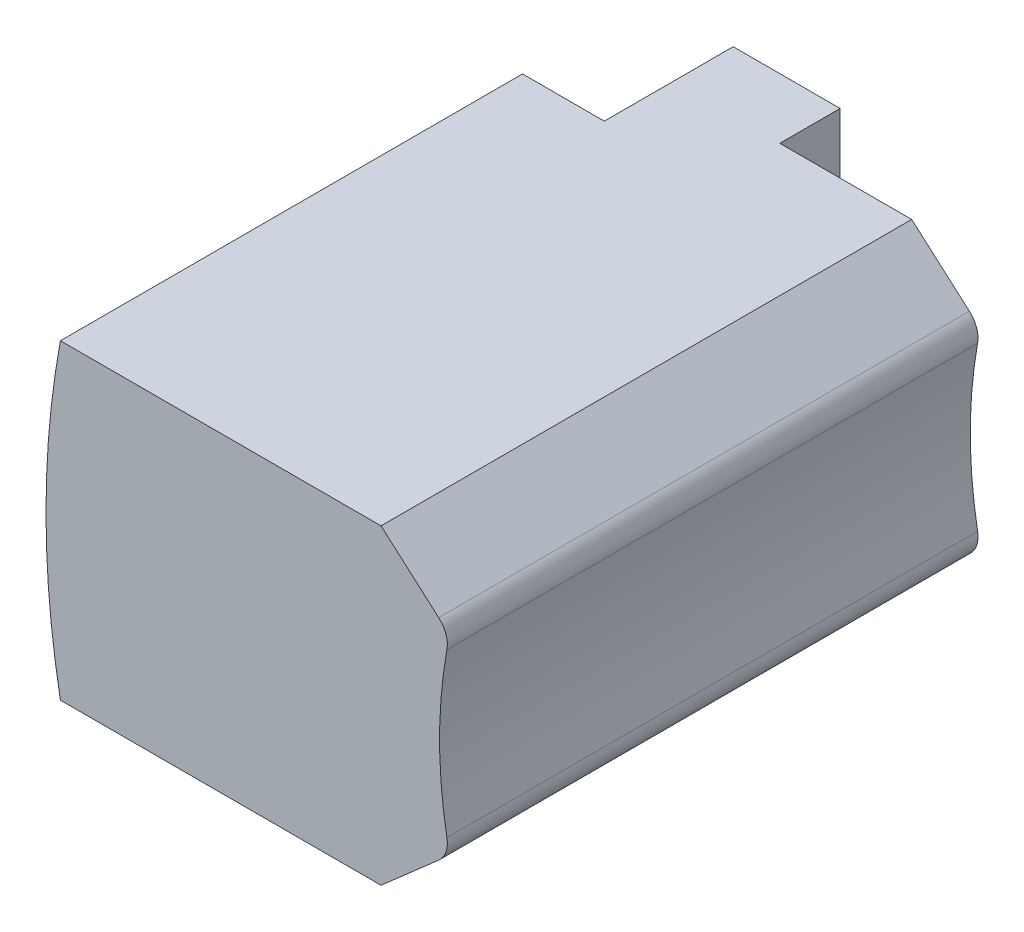
ISO-10303-21;
HEADER;
FILE_DESCRIPTION(('STEP AP214'),'2;1');
FILE_NAME('part.step','',(''),(''),'','','');
FILE_SCHEMA(('AUTOMOTIVE_DESIGN { 1 0 10303 214 1 1 1 1 }'));
ENDSEC;
DATA;
#1=APPLICATION_CONTEXT('core data for automotive mechanical design processes');
#2=APPLICATION_PROTOCOL_DEFINITION('international standard','automotive_design',2000,#1);
#3=PRODUCT_CONTEXT('',#1,'mechanical');
#4=PRODUCT('Part','Part','',(#3));
#5=PRODUCT_RELATED_PRODUCT_CATEGORY('part','',(#4));
#6=PRODUCT_DEFINITION_FORMATION('','',#4);
#7=PRODUCT_DEFINITION_CONTEXT('part definition',#1,'design');
#8=PRODUCT_DEFINITION('design','',#6,#7);
#9=PRODUCT_DEFINITION_SHAPE('','',#8);
#10=(LENGTH_UNIT() NAMED_UNIT(*) SI_UNIT(.MILLI.,.METRE.));
#11=(NAMED_UNIT(*) PLANE_ANGLE_UNIT() SI_UNIT($,.RADIAN.));
#12=(NAMED_UNIT(*) SI_UNIT($,.STERADIAN.) SOLID_ANGLE_UNIT());
#13=UNCERTAINTY_MEASURE_WITH_UNIT(LENGTH_MEASURE(1.E-05),#10,'distance_accuracy_value','');
#14=(GEOMETRIC_REPRESENTATION_CONTEXT(3) GLOBAL_UNCERTAINTY_ASSIGNED_CONTEXT((#13)) GLOBAL_UNIT_ASSIGNED_CONTEXT((#10,
#11,#12)) REPRESENTATION_CONTEXT('',''));
#15=CARTESIAN_POINT('',(0.,0.,0.));
#16=DIRECTION('',(0.,0.,1.));
#17=DIRECTION('',(1.,0.,0.));
#18=AXIS2_PLACEMENT_3D('',#15,#16,#17);
#19=CARTESIAN_POINT('',(30.001601500084,1.38260051198754E-10,77.7));
#20=DIRECTION('',(0.,0.,-1.));
#21=DIRECTION('',(1.,-2.934E-12,0.));
#22=AXIS2_PLACEMENT_3D('',#19,#20,#21);
#23=PLANE('',#22);
#24=CARTESIAN_POINT('',(42.6909678523777,-6.26876623080783,77.7));
#25=DIRECTION('',(0.,0.,-1.));
#26=DIRECTION('',(0.94433415351405,-0.32898785160991,0.));
#27=AXIS2_PLACEMENT_3D('',#24,#25,#26);
#28=CIRCLE('',#27,1.85);
#29=CARTESIAN_POINT('',(44.5110524087522,-5.93741715860799,77.7));
#30=VERTEX_POINT('',#29);
#31=CARTESIAN_POINT('',(43.9111825704376,-7.65929707973922,77.7));
#32=VERTEX_POINT('',#31);
#33=EDGE_CURVE('E347',#30,#32,#28,.T.);
#34=ORIENTED_EDGE('',*,*,#33,.F.);
#35=CARTESIAN_POINT('',(77.125,0.,77.7));
#36=DIRECTION('',(0.,0.,-1.));
#37=DIRECTION('',(0.977175666662194,0.212432851704476,0.));
#38=AXIS2_PLACEMENT_3D('',#35,#36,#37);
#39=CIRCLE('',#38,33.15);
#40=CARTESIAN_POINT('',(44.511052408787,5.93741715879937,77.7));
#41=VERTEX_POINT('',#40);
#42=EDGE_CURVE('E333',#30,#41,#39,.T.);
#43=ORIENTED_EDGE('',*,*,#42,.T.);
#44=CARTESIAN_POINT('',(42.6909678524145,6.26876623100989,77.7));
#45=DIRECTION('',(0.,0.,-1.));
#46=DIRECTION('',(0.944334153515979,0.32898785160437,0.));
#47=AXIS2_PLACEMENT_3D('',#44,#45,#46);
#48=CIRCLE('',#47,1.85);
#49=CARTESIAN_POINT('',(43.9111825704826,7.65929707993412,77.7));
#50=VERTEX_POINT('',#49);
#51=EDGE_CURVE('E238',#50,#41,#48,.T.);
#52=ORIENTED_EDGE('',*,*,#51,.F.);
#53=DIRECTION('',(-0.751638296715807,0.659575523280057,0.));
#54=VECTOR('',#53,1.);
#55=CARTESIAN_POINT('',(42.3146403354953,9.06029032985442,77.7));
#56=LINE('',#55,#54);
#57=CARTESIAN_POINT('',(39.7053356906447,11.3500000001098,77.7));
#58=VERTEX_POINT('',#57);
#59=EDGE_CURVE('E249',#50,#58,#56,.T.);
#60=ORIENTED_EDGE('',*,*,#59,.T.);
#61=DIRECTION('',(-1.,2.93409424263259E-12,0.));
#62=VECTOR('',#61,1.);
#63=CARTESIAN_POINT('',(26.1446641110108,11.3500000001496,77.7));
#64=LINE('',#63,#62);
#65=CARTESIAN_POINT('',(16.3253289482884,11.3500000001781,77.7));
#66=VERTEX_POINT('',#65);
#67=EDGE_CURVE('E212',#58,#66,#64,.T.);
#68=ORIENTED_EDGE('',*,*,#67,.T.);
#69=CARTESIAN_POINT('',(77.125,0.,77.7));
#70=DIRECTION('',(0.,0.,1.));
#71=DIRECTION('',(-0.896391606528745,-0.443263000649521,0.));
#72=AXIS2_PLACEMENT_3D('',#69,#70,#71);
#73=CIRCLE('',#72,61.85);
#74=CARTESIAN_POINT('',(16.3253289482218,-11.3499999998214,77.7));
#75=VERTEX_POINT('',#74);
#76=EDGE_CURVE('E228',#66,#75,#73,.T.);
#77=ORIENTED_EDGE('',*,*,#76,.T.);
#78=DIRECTION('',(1.,-2.93390575736741E-12,0.));
#79=VECTOR('',#78,1.);
#80=CARTESIAN_POINT('',(30.0446641109441,-11.3499999998619,77.7));
#81=LINE('',#80,#79);
#82=CARTESIAN_POINT('',(39.7053356905781,-11.3499999998902,77.7));
#83=VERTEX_POINT('',#82);
#84=EDGE_CURVE('E59',#75,#83,#81,.T.);
#85=ORIENTED_EDGE('',*,*,#84,.T.);
#86=DIRECTION('',(0.751638296719677,0.659575523275647,0.));
#87=VECTOR('',#86,1.);
#88=CARTESIAN_POINT('',(30.6498990329774,-19.2963012966614,77.7));
#89=LINE('',#88,#87);
#90=EDGE_CURVE('E11',#83,#32,#89,.T.);
#91=ORIENTED_EDGE('',*,*,#90,.T.);
#92=EDGE_LOOP('',(#34,#43,#52,#60,#68,#77,#85,#91));
#93=FACE_BOUND('',#92,.T.);
#94=ADVANCED_FACE('F51',(#93),#23,.F.);
#95=CARTESIAN_POINT('',(21.4497840667264,-27.3695602957623,39.));
#96=DIRECTION('',(0.659575523275647,-0.751638296719677,0.));
#97=DIRECTION('',(0.,0.,1.));
#98=AXIS2_PLACEMENT_3D('',#95,#96,#97);
#99=PLANE('',#98);
#100=DIRECTION('',(0.,0.,-1.));
#101=VECTOR('',#100,1.);
#102=CARTESIAN_POINT('',(43.9111825704376,-7.65929707973922,39.));
#103=LINE('',#102,#101);
#104=CARTESIAN_POINT('',(43.9111825704376,-7.65929707973922,39.));
#105=VERTEX_POINT('',#104);
#106=EDGE_CURVE('E329',#32,#105,#103,.T.);
#107=ORIENTED_EDGE('',*,*,#106,.F.);
#108=ORIENTED_EDGE('',*,*,#90,.F.);
#109=DIRECTION('',(0.,0.,-1.));
#110=VECTOR('',#109,1.);
#111=CARTESIAN_POINT('',(39.7053356905781,-11.3499999998902,39.));
#112=LINE('',#111,#110);
#113=CARTESIAN_POINT('',(39.7053356905781,-11.3499999998902,39.));
#114=VERTEX_POINT('',#113);
#115=EDGE_CURVE('E305',#83,#114,#112,.T.);
#116=ORIENTED_EDGE('',*,*,#115,.T.);
#117=DIRECTION('',(-0.751638296719677,-0.659575523275647,0.));
#118=VECTOR('',#117,1.);
#119=CARTESIAN_POINT('',(30.6498990329774,-19.2963012966614,39.));
#120=LINE('',#119,#118);
#121=EDGE_CURVE('E326',#105,#114,#120,.T.);
#122=ORIENTED_EDGE('',*,*,#121,.F.);
#123=EDGE_LOOP('',(#107,#108,#116,#122));
#124=FACE_BOUND('',#123,.T.);
#125=ADVANCED_FACE('F325',(#124),#99,.T.);
#126=CARTESIAN_POINT('',(26.1877267218496,-7.27499999985055,34.6));
#127=DIRECTION('',(0.,0.,-1.));
#128=DIRECTION('',(1.,-2.934E-12,0.));
#129=AXIS2_PLACEMENT_3D('',#126,#127,#128);
#130=PLANE('',#129);
#131=DIRECTION('',(-1.,2.93390575736741E-12,0.));
#132=VECTOR('',#131,1.);
#133=CARTESIAN_POINT('',(28.1377267218377,-11.3499999998563,34.6));
#134=LINE('',#133,#132);
#135=CARTESIAN_POINT('',(30.0877267218378,-11.349999999862,34.6));
#136=VERTEX_POINT('',#135);
#137=CARTESIAN_POINT('',(22.2877267218378,-11.3499999998391,34.6));
#138=VERTEX_POINT('',#137);
#139=EDGE_CURVE('E308',#136,#138,#134,.T.);
#140=ORIENTED_EDGE('',*,*,#139,.T.);
#141=DIRECTION('',(2.934E-12,1.,0.));
#142=VECTOR('',#141,1.);
#143=CARTESIAN_POINT('',(22.2877267217924,-26.8338152878942,34.6));
#144=LINE('',#143,#142);
#145=CARTESIAN_POINT('',(22.2877267218621,-3.04999999983911,34.6));
#146=VERTEX_POINT('',#145);
#147=EDGE_CURVE('E282',#138,#146,#144,.T.);
#148=ORIENTED_EDGE('',*,*,#147,.T.);
#149=DIRECTION('',(1.,-2.93385766371479E-12,0.));
#150=VECTOR('',#149,1.);
#151=CARTESIAN_POINT('',(22.2877267218621,-3.04999999983911,34.6));
#152=LINE('',#151,#150);
#153=CARTESIAN_POINT('',(30.0877267218621,-3.04999999986199,34.6));
#154=VERTEX_POINT('',#153);
#155=EDGE_CURVE('E78',#146,#154,#152,.T.);
#156=ORIENTED_EDGE('',*,*,#155,.T.);
#157=DIRECTION('',(-2.934E-12,-1.,0.));
#158=VECTOR('',#157,1.);
#159=CARTESIAN_POINT('',(30.0877267219297,19.9891812347753,34.6));
#160=LINE('',#159,#158);
#161=EDGE_CURVE('E299',#154,#136,#160,.T.);
#162=ORIENTED_EDGE('',*,*,#161,.T.);
#163=EDGE_LOOP('',(#140,#148,#156,#162));
#164=FACE_BOUND('',#163,.T.);
#165=ADVANCED_FACE('F424',(#164),#130,.T.);
#166=CARTESIAN_POINT('',(30.0877267218378,-11.349999999862,39.));
#167=DIRECTION('',(-2.93390575736741E-12,-1.,0.));
#168=DIRECTION('',(0.,0.,1.));
#169=AXIS2_PLACEMENT_3D('',#166,#167,#168);
#170=PLANE('',#169);
#171=DIRECTION('',(0.,0.,1.));
#172=VECTOR('',#171,1.);
#173=CARTESIAN_POINT('',(22.2877267218378,-11.3499999998391,39.));
#174=LINE('',#173,#172);
#175=CARTESIAN_POINT('',(22.2877267218378,-11.3499999998391,44.));
#176=VERTEX_POINT('',#175);
#177=EDGE_CURVE('E285',#138,#176,#174,.T.);
#178=ORIENTED_EDGE('',*,*,#177,.F.);
#179=ORIENTED_EDGE('',*,*,#139,.F.);
#180=DIRECTION('',(0.,0.,-1.));
#181=VECTOR('',#180,1.);
#182=CARTESIAN_POINT('',(30.0877267218378,-11.349999999862,39.));
#183=LINE('',#182,#181);
#184=CARTESIAN_POINT('',(30.0877267218378,-11.349999999862,39.));
#185=VERTEX_POINT('',#184);
#186=EDGE_CURVE('E211',#185,#136,#183,.T.);
#187=ORIENTED_EDGE('',*,*,#186,.F.);
#188=DIRECTION('',(-1.,2.93390575736741E-12,0.));
#189=VECTOR('',#188,1.);
#190=CARTESIAN_POINT('',(30.0446641109441,-11.3499999998619,39.));
#191=LINE('',#190,#189);
#192=EDGE_CURVE('E323',#114,#185,#191,.T.);
#193=ORIENTED_EDGE('',*,*,#192,.F.);
#194=ORIENTED_EDGE('',*,*,#115,.F.);
#195=ORIENTED_EDGE('',*,*,#84,.F.);
#196=DIRECTION('',(0.,0.,1.));
#197=VECTOR('',#196,1.);
#198=CARTESIAN_POINT('',(16.3253289482251,-11.3499999998216,39.));
#199=LINE('',#198,#197);
#200=CARTESIAN_POINT('',(16.3253289482218,-11.3499999998214,44.));
#201=VERTEX_POINT('',#200);
#202=EDGE_CURVE('E233',#201,#75,#199,.T.);
#203=ORIENTED_EDGE('',*,*,#202,.F.);
#204=DIRECTION('',(-1.,2.93390575736741E-12,0.));
#205=VECTOR('',#204,1.);
#206=CARTESIAN_POINT('',(24.39704504137,-11.3499999998453,44.));
#207=LINE('',#206,#205);
#208=EDGE_CURVE('E261',#176,#201,#207,.T.);
#209=ORIENTED_EDGE('',*,*,#208,.F.);
#210=EDGE_LOOP('',(#178,#179,#187,#193,#194,#195,#203,#209));
#211=FACE_BOUND('',#210,.T.);
#212=ADVANCED_FACE('F321',(#211),#170,.T.);
#213=CARTESIAN_POINT('',(22.2877267218621,-3.04999999983911,39.));
#214=DIRECTION('',(2.93385766371479E-12,1.,0.));
#215=DIRECTION('',(1.,-2.93385766371479E-12,0.));
#216=AXIS2_PLACEMENT_3D('',#213,#214,#215);
#217=PLANE('',#216);
#218=DIRECTION('',(-1.,2.93385766371479E-12,0.));
#219=VECTOR('',#218,1.);
#220=CARTESIAN_POINT('',(26.1446641109686,-3.04999999985042,39.));
#221=LINE('',#220,#219);
#222=CARTESIAN_POINT('',(30.0877267218621,-3.04999999986199,39.));
#223=VERTEX_POINT('',#222);
#224=CARTESIAN_POINT('',(22.2877267218621,-3.04999999983911,39.));
#225=VERTEX_POINT('',#224);
#226=EDGE_CURVE('E357',#223,#225,#221,.T.);
#227=ORIENTED_EDGE('',*,*,#226,.F.);
#228=DIRECTION('',(0.,0.,-1.));
#229=VECTOR('',#228,1.);
#230=CARTESIAN_POINT('',(30.0877267218621,-3.04999999986199,39.));
#231=LINE('',#230,#229);
#232=EDGE_CURVE('E302',#223,#154,#231,.T.);
#233=ORIENTED_EDGE('',*,*,#232,.T.);
#234=ORIENTED_EDGE('',*,*,#155,.F.);
#235=DIRECTION('',(0.,0.,-1.));
#236=VECTOR('',#235,1.);
#237=CARTESIAN_POINT('',(22.2877267218621,-3.04999999983911,39.));
#238=LINE('',#237,#236);
#239=EDGE_CURVE('E278',#225,#146,#238,.T.);
#240=ORIENTED_EDGE('',*,*,#239,.F.);
#241=EDGE_LOOP('',(#227,#233,#234,#240));
#242=FACE_BOUND('',#241,.T.);
#243=ADVANCED_FACE('F431',(#242),#217,.T.);
#244=CARTESIAN_POINT('',(30.0877267218621,-3.04999999986199,39.));
#245=DIRECTION('',(1.,-2.934E-12,0.));
#246=DIRECTION('',(0.,0.,-1.));
#247=AXIS2_PLACEMENT_3D('',#244,#245,#246);
#248=PLANE('',#247);
#249=DIRECTION('',(2.934E-12,1.,0.));
#250=VECTOR('',#249,1.);
#251=CARTESIAN_POINT('',(30.0877267218666,-1.52499999986199,39.));
#252=LINE('',#251,#250);
#253=EDGE_CURVE('E354',#185,#223,#252,.T.);
#254=ORIENTED_EDGE('',*,*,#253,.F.);
#255=ORIENTED_EDGE('',*,*,#186,.T.);
#256=ORIENTED_EDGE('',*,*,#161,.F.);
#257=ORIENTED_EDGE('',*,*,#232,.F.);
#258=EDGE_LOOP('',(#254,#255,#256,#257));
#259=FACE_BOUND('',#258,.T.);
#260=ADVANCED_FACE('F428',(#259),#248,.T.);
#261=CARTESIAN_POINT('',(26.1877267218923,7.27500000014945,34.6));
#262=DIRECTION('',(0.,0.,-1.));
#263=DIRECTION('',(1.,-2.934E-12,0.));
#264=AXIS2_PLACEMENT_3D('',#261,#262,#263);
#265=PLANE('',#264);
#266=DIRECTION('',(-1.,2.93414233628521E-12,0.));
#267=VECTOR('',#266,1.);
#268=CARTESIAN_POINT('',(30.0877267218801,3.05000000013801,34.6));
#269=LINE('',#268,#267);
#270=CARTESIAN_POINT('',(30.0877267218801,3.05000000013801,34.6));
#271=VERTEX_POINT('',#270);
#272=CARTESIAN_POINT('',(22.28772672188,3.05000000016089,34.6));
#273=VERTEX_POINT('',#272);
#274=EDGE_CURVE('E199',#271,#273,#269,.T.);
#275=ORIENTED_EDGE('',*,*,#274,.T.);
#276=DIRECTION('',(2.934E-12,1.,0.));
#277=VECTOR('',#276,1.);
#278=CARTESIAN_POINT('',(22.2877267217924,-26.8338152878942,34.6));
#279=LINE('',#278,#277);
#280=CARTESIAN_POINT('',(22.2877267219044,11.3500000001609,34.6));
#281=VERTEX_POINT('',#280);
#282=EDGE_CURVE('E273',#273,#281,#279,.T.);
#283=ORIENTED_EDGE('',*,*,#282,.T.);
#284=DIRECTION('',(1.,-2.93409424263259E-12,0.));
#285=VECTOR('',#284,1.);
#286=CARTESIAN_POINT('',(24.2377267219044,11.3500000001552,34.6));
#287=LINE('',#286,#285);
#288=CARTESIAN_POINT('',(30.0877267219044,11.350000000138,34.6));
#289=VERTEX_POINT('',#288);
#290=EDGE_CURVE('E217',#281,#289,#287,.T.);
#291=ORIENTED_EDGE('',*,*,#290,.T.);
#292=DIRECTION('',(-2.934E-12,-1.,0.));
#293=VECTOR('',#292,1.);
#294=CARTESIAN_POINT('',(30.0877267219297,19.9891812347753,34.6));
#295=LINE('',#294,#293);
#296=EDGE_CURVE('E215',#289,#271,#295,.T.);
#297=ORIENTED_EDGE('',*,*,#296,.T.);
#298=EDGE_LOOP('',(#275,#283,#291,#297));
#299=FACE_BOUND('',#298,.T.);
#300=ADVANCED_FACE('F216',(#299),#265,.T.);
#301=CARTESIAN_POINT('',(30.0877267218801,3.05000000013801,39.));
#302=DIRECTION('',(-2.93414233628521E-12,-1.,0.));
#303=DIRECTION('',(-1.,2.93414233628521E-12,0.));
#304=AXIS2_PLACEMENT_3D('',#301,#302,#303);
#305=PLANE('',#304);
#306=DIRECTION('',(1.,-2.93414233628521E-12,0.));
#307=VECTOR('',#306,1.);
#308=CARTESIAN_POINT('',(30.0446641109863,3.05000000013813,39.));
#309=LINE('',#308,#307);
#310=CARTESIAN_POINT('',(22.28772672188,3.05000000016089,39.));
#311=VERTEX_POINT('',#310);
#312=CARTESIAN_POINT('',(30.0877267218801,3.05000000013801,39.));
#313=VERTEX_POINT('',#312);
#314=EDGE_CURVE('E372',#311,#313,#309,.T.);
#315=ORIENTED_EDGE('',*,*,#314,.F.);
#316=DIRECTION('',(0.,0.,-1.));
#317=VECTOR('',#316,1.);
#318=CARTESIAN_POINT('',(22.28772672188,3.05000000016089,39.));
#319=LINE('',#318,#317);
#320=EDGE_CURVE('E206',#311,#273,#319,.T.);
#321=ORIENTED_EDGE('',*,*,#320,.T.);
#322=ORIENTED_EDGE('',*,*,#274,.F.);
#323=DIRECTION('',(0.,0.,-1.));
#324=VECTOR('',#323,1.);
#325=CARTESIAN_POINT('',(30.0877267218801,3.05000000013801,39.));
#326=LINE('',#325,#324);
#327=EDGE_CURVE('E204',#313,#271,#326,.T.);
#328=ORIENTED_EDGE('',*,*,#327,.F.);
#329=EDGE_LOOP('',(#315,#321,#322,#328));
#330=FACE_BOUND('',#329,.T.);
#331=ADVANCED_FACE('F202',(#330),#305,.T.);
#332=CARTESIAN_POINT('',(22.2877267219044,11.3500000001609,39.));
#333=DIRECTION('',(2.93409424263259E-12,1.,0.));
#334=DIRECTION('',(1.,-2.93409424263259E-12,0.));
#335=AXIS2_PLACEMENT_3D('',#332,#333,#334);
#336=PLANE('',#335);
#337=DIRECTION('',(0.,0.,-1.));
#338=VECTOR('',#337,1.);
#339=CARTESIAN_POINT('',(30.0877267219044,11.350000000138,39.));
#340=LINE('',#339,#338);
#341=CARTESIAN_POINT('',(30.0877267219044,11.350000000138,39.));
#342=VERTEX_POINT('',#341);
#343=EDGE_CURVE('E221',#342,#289,#340,.T.);
#344=ORIENTED_EDGE('',*,*,#343,.T.);
#345=ORIENTED_EDGE('',*,*,#290,.F.);
#346=DIRECTION('',(0.,0.,-1.));
#347=VECTOR('',#346,1.);
#348=CARTESIAN_POINT('',(22.2877267219044,11.3500000001609,39.));
#349=LINE('',#348,#347);
#350=CARTESIAN_POINT('',(22.2877267219044,11.3500000001609,44.));
#351=VERTEX_POINT('',#350);
#352=EDGE_CURVE('E269',#351,#281,#349,.T.);
#353=ORIENTED_EDGE('',*,*,#352,.F.);
#354=DIRECTION('',(1.,-2.93409424263259E-12,0.));
#355=VECTOR('',#354,1.);
#356=CARTESIAN_POINT('',(20.4970450414367,11.3500000001661,44.));
#357=LINE('',#356,#355);
#358=CARTESIAN_POINT('',(16.3253289482884,11.3500000001781,44.));
#359=VERTEX_POINT('',#358);
#360=EDGE_CURVE('E253',#359,#351,#357,.T.);
#361=ORIENTED_EDGE('',*,*,#360,.F.);
#362=DIRECTION('',(0.,0.,-1.));
#363=VECTOR('',#362,1.);
#364=CARTESIAN_POINT('',(16.3253289482917,11.3500000001784,39.));
#365=LINE('',#364,#363);
#366=EDGE_CURVE('E288',#66,#359,#365,.T.);
#367=ORIENTED_EDGE('',*,*,#366,.F.);
#368=ORIENTED_EDGE('',*,*,#67,.F.);
#369=DIRECTION('',(0.,0.,1.));
#370=VECTOR('',#369,1.);
#371=CARTESIAN_POINT('',(39.7053356906447,11.3500000001098,39.));
#372=LINE('',#371,#370);
#373=CARTESIAN_POINT('',(39.7053356906447,11.3500000001098,39.));
#374=VERTEX_POINT('',#373);
#375=EDGE_CURVE('E245',#374,#58,#372,.T.);
#376=ORIENTED_EDGE('',*,*,#375,.F.);
#377=DIRECTION('',(1.,-2.93409424263259E-12,0.));
#378=VECTOR('',#377,1.);
#379=CARTESIAN_POINT('',(26.1446641110108,11.3500000001496,39.));
#380=LINE('',#379,#378);
#381=EDGE_CURVE('E383',#342,#374,#380,.T.);
#382=ORIENTED_EDGE('',*,*,#381,.F.);
#383=EDGE_LOOP('',(#344,#345,#353,#361,#367,#368,#376,#382));
#384=FACE_BOUND('',#383,.T.);
#385=ADVANCED_FACE('F410',(#384),#336,.T.);
#386=CARTESIAN_POINT('',(30.0877267219048,11.500000000138,39.));
#387=DIRECTION('',(1.,-2.934E-12,0.));
#388=DIRECTION('',(0.,0.,-1.));
#389=AXIS2_PLACEMENT_3D('',#386,#387,#388);
#390=PLANE('',#389);
#391=DIRECTION('',(2.934E-12,1.,0.));
#392=VECTOR('',#391,1.);
#393=CARTESIAN_POINT('',(30.087726721888,5.75000000013801,39.));
#394=LINE('',#393,#392);
#395=EDGE_CURVE('E225',#313,#342,#394,.T.);
#396=ORIENTED_EDGE('',*,*,#395,.F.);
#397=ORIENTED_EDGE('',*,*,#327,.T.);
#398=ORIENTED_EDGE('',*,*,#296,.F.);
#399=ORIENTED_EDGE('',*,*,#343,.F.);
#400=EDGE_LOOP('',(#396,#397,#398,#399));
#401=FACE_BOUND('',#400,.T.);
#402=ADVANCED_FACE('F223',(#401),#390,.T.);
#403=CARTESIAN_POINT('',(77.125,0.,39.));
#404=DIRECTION('',(0.,0.,1.));
#405=DIRECTION('',(-0.896391606528745,-0.443263000649521,0.));
#406=AXIS2_PLACEMENT_3D('',#403,#404,#405);
#407=CYLINDRICAL_SURFACE('',#406,61.85);
#408=ORIENTED_EDGE('',*,*,#366,.T.);
#409=CARTESIAN_POINT('',(77.125,0.,44.));
#410=DIRECTION('',(0.,0.,1.));
#411=DIRECTION('',(-0.896391606528745,-0.443263000649521,0.));
#412=AXIS2_PLACEMENT_3D('',#409,#410,#411);
#413=CIRCLE('',#412,61.85);
#414=EDGE_CURVE('E265',#359,#201,#413,.T.);
#415=ORIENTED_EDGE('',*,*,#414,.T.);
#416=ORIENTED_EDGE('',*,*,#202,.T.);
#417=ORIENTED_EDGE('',*,*,#76,.F.);
#418=EDGE_LOOP('',(#408,#415,#416,#417));
#419=FACE_BOUND('',#418,.T.);
#420=ADVANCED_FACE('F415',(#419),#407,.T.);
#421=CARTESIAN_POINT('',(22.2877267218374,-11.4999999998391,39.));
#422=DIRECTION('',(-1.,2.934E-12,0.));
#423=DIRECTION('',(2.934E-12,1.,0.));
#424=AXIS2_PLACEMENT_3D('',#421,#422,#423);
#425=PLANE('',#424);
#426=ORIENTED_EDGE('',*,*,#352,.T.);
#427=ORIENTED_EDGE('',*,*,#282,.F.);
#428=ORIENTED_EDGE('',*,*,#320,.F.);
#429=DIRECTION('',(2.934E-12,1.,0.));
#430=VECTOR('',#429,1.);
#431=CARTESIAN_POINT('',(22.2877267218317,-13.4169076438667,39.));
#432=LINE('',#431,#430);
#433=EDGE_CURVE('E368',#225,#311,#432,.T.);
#434=ORIENTED_EDGE('',*,*,#433,.F.);
#435=ORIENTED_EDGE('',*,*,#239,.T.);
#436=ORIENTED_EDGE('',*,*,#147,.F.);
#437=ORIENTED_EDGE('',*,*,#177,.T.);
#438=DIRECTION('',(2.934E-12,1.,0.));
#439=VECTOR('',#438,1.);
#440=CARTESIAN_POINT('',(22.2877267219498,26.833815288216,44.));
#441=LINE('',#440,#439);
#442=EDGE_CURVE('E257',#176,#351,#441,.T.);
#443=ORIENTED_EDGE('',*,*,#442,.T.);
#444=EDGE_LOOP('',(#426,#427,#428,#434,#435,#436,#437,#443));
#445=FACE_BOUND('',#444,.T.);
#446=ADVANCED_FACE('F422',(#445),#425,.T.);
#447=CARTESIAN_POINT('',(18.7063633609354,1.71400279899016E-10,44.));
#448=DIRECTION('',(0.,0.,-1.));
#449=DIRECTION('',(1.,-2.934E-12,0.));
#450=AXIS2_PLACEMENT_3D('',#447,#448,#449);
#451=PLANE('',#450);
#452=ORIENTED_EDGE('',*,*,#360,.T.);
#453=ORIENTED_EDGE('',*,*,#442,.F.);
#454=ORIENTED_EDGE('',*,*,#208,.T.);
#455=ORIENTED_EDGE('',*,*,#414,.F.);
#456=EDGE_LOOP('',(#452,#453,#454,#455));
#457=FACE_BOUND('',#456,.T.);
#458=ADVANCED_FACE('F417',(#457),#451,.T.);
#459=CARTESIAN_POINT('',(44.7792666716968,6.89753836192955,39.));
#460=DIRECTION('',(0.659575523280057,0.751638296715807,0.));
#461=DIRECTION('',(0.,0.,1.));
#462=AXIS2_PLACEMENT_3D('',#459,#460,#461);
#463=PLANE('',#462);
#464=DIRECTION('',(0.,0.,1.));
#465=VECTOR('',#464,1.);
#466=CARTESIAN_POINT('',(43.9111825704826,7.65929707993412,39.));
#467=LINE('',#466,#465);
#468=CARTESIAN_POINT('',(43.9111825704826,7.65929707993412,39.));
#469=VERTEX_POINT('',#468);
#470=EDGE_CURVE('E241',#469,#50,#467,.T.);
#471=ORIENTED_EDGE('',*,*,#470,.F.);
#472=DIRECTION('',(0.751638296715807,-0.659575523280057,0.));
#473=VECTOR('',#472,1.);
#474=CARTESIAN_POINT('',(42.3146403354953,9.06029032985442,39.));
#475=LINE('',#474,#473);
#476=EDGE_CURVE('E392',#374,#469,#475,.T.);
#477=ORIENTED_EDGE('',*,*,#476,.F.);
#478=ORIENTED_EDGE('',*,*,#375,.T.);
#479=ORIENTED_EDGE('',*,*,#59,.F.);
#480=EDGE_LOOP('',(#471,#477,#478,#479));
#481=FACE_BOUND('',#480,.T.);
#482=ADVANCED_FACE('F407',(#481),#463,.T.);
#483=CARTESIAN_POINT('',(42.6909678524145,6.26876623100989,39.));
#484=DIRECTION('',(0.,0.,1.));
#485=DIRECTION('',(0.944334153515979,0.32898785160437,0.));
#486=AXIS2_PLACEMENT_3D('',#483,#484,#485);
#487=CYLINDRICAL_SURFACE('',#486,1.85);
#488=ORIENTED_EDGE('',*,*,#51,.T.);
#489=DIRECTION('',(0.,0.,-1.));
#490=VECTOR('',#489,1.);
#491=CARTESIAN_POINT('',(44.511052408787,5.93741715879937,39.));
#492=LINE('',#491,#490);
#493=CARTESIAN_POINT('',(44.511052408787,5.93741715879937,39.));
#494=VERTEX_POINT('',#493);
#495=EDGE_CURVE('E367',#41,#494,#492,.T.);
#496=ORIENTED_EDGE('',*,*,#495,.T.);
#497=CARTESIAN_POINT('',(42.6909678524145,6.26876623100989,39.));
#498=DIRECTION('',(0.,0.,1.));
#499=DIRECTION('',(0.944334153515979,0.32898785160437,0.));
#500=AXIS2_PLACEMENT_3D('',#497,#498,#499);
#501=CIRCLE('',#500,1.85);
#502=EDGE_CURVE('E237',#494,#469,#501,.T.);
#503=ORIENTED_EDGE('',*,*,#502,.T.);
#504=ORIENTED_EDGE('',*,*,#470,.T.);
#505=EDGE_LOOP('',(#488,#496,#503,#504));
#506=FACE_BOUND('',#505,.T.);
#507=ADVANCED_FACE('F401',(#506),#487,.T.);
#508=CARTESIAN_POINT('',(30.001601500084,1.38260051198754E-10,39.));
#509=DIRECTION('',(0.,0.,-1.));
#510=DIRECTION('',(1.,-2.934E-12,0.));
#511=AXIS2_PLACEMENT_3D('',#508,#509,#510);
#512=PLANE('',#511);
#513=CARTESIAN_POINT('',(42.6909678523777,-6.26876623080783,39.));
#514=DIRECTION('',(0.,0.,1.));
#515=DIRECTION('',(0.94433415351405,-0.32898785160991,0.));
#516=AXIS2_PLACEMENT_3D('',#513,#514,#515);
#517=CIRCLE('',#516,1.85);
#518=CARTESIAN_POINT('',(44.5110524087522,-5.93741715860799,39.));
#519=VERTEX_POINT('',#518);
#520=EDGE_CURVE('E336',#105,#519,#517,.T.);
#521=ORIENTED_EDGE('',*,*,#520,.F.);
#522=ORIENTED_EDGE('',*,*,#121,.T.);
#523=ORIENTED_EDGE('',*,*,#192,.T.);
#524=ORIENTED_EDGE('',*,*,#253,.T.);
#525=ORIENTED_EDGE('',*,*,#226,.T.);
#526=ORIENTED_EDGE('',*,*,#433,.T.);
#527=ORIENTED_EDGE('',*,*,#314,.T.);
#528=ORIENTED_EDGE('',*,*,#395,.T.);
#529=ORIENTED_EDGE('',*,*,#381,.T.);
#530=ORIENTED_EDGE('',*,*,#476,.T.);
#531=ORIENTED_EDGE('',*,*,#502,.F.);
#532=CARTESIAN_POINT('',(77.125,0.,39.));
#533=DIRECTION('',(0.,0.,1.));
#534=DIRECTION('',(0.977175666662194,0.212432851704476,0.));
#535=AXIS2_PLACEMENT_3D('',#532,#533,#534);
#536=CIRCLE('',#535,33.15);
#537=EDGE_CURVE('E339',#494,#519,#536,.T.);
#538=ORIENTED_EDGE('',*,*,#537,.T.);
#539=EDGE_LOOP('',(#521,#522,#523,#524,#525,#526,#527,#528,#529,#530,#531,#538));
#540=FACE_BOUND('',#539,.T.);
#541=ADVANCED_FACE('F337',(#540),#512,.T.);
#542=CARTESIAN_POINT('',(77.125,0.,39.));
#543=DIRECTION('',(0.,0.,1.));
#544=DIRECTION('',(0.977175666662194,0.212432851704476,0.));
#545=AXIS2_PLACEMENT_3D('',#542,#543,#544);
#546=CYLINDRICAL_SURFACE('',#545,33.15);
#547=DIRECTION('',(0.,0.,1.));
#548=VECTOR('',#547,1.);
#549=CARTESIAN_POINT('',(44.5110524087522,-5.93741715860799,39.));
#550=LINE('',#549,#548);
#551=EDGE_CURVE('E344',#519,#30,#550,.T.);
#552=ORIENTED_EDGE('',*,*,#551,.F.);
#553=ORIENTED_EDGE('',*,*,#537,.F.);
#554=ORIENTED_EDGE('',*,*,#495,.F.);
#555=ORIENTED_EDGE('',*,*,#42,.F.);
#556=EDGE_LOOP('',(#552,#553,#554,#555));
#557=FACE_BOUND('',#556,.T.);
#558=ADVANCED_FACE('F405',(#557),#546,.F.);
#559=CARTESIAN_POINT('',(42.6909678523777,-6.26876623080783,39.));
#560=DIRECTION('',(0.,0.,1.));
#561=DIRECTION('',(0.94433415351405,-0.32898785160991,0.));
#562=AXIS2_PLACEMENT_3D('',#559,#560,#561);
#563=CYLINDRICAL_SURFACE('',#562,1.85);
#564=ORIENTED_EDGE('',*,*,#33,.T.);
#565=ORIENTED_EDGE('',*,*,#106,.T.);
#566=ORIENTED_EDGE('',*,*,#520,.T.);
#567=ORIENTED_EDGE('',*,*,#551,.T.);
#568=EDGE_LOOP('',(#564,#565,#566,#567));
#569=FACE_BOUND('',#568,.T.);
#570=ADVANCED_FACE('F346',(#569),#563,.T.);
#571=CLOSED_SHELL('',(#94,#125,#165,#212,#243,#260,#300,#331,#385,#402,#420,#446,#458,#482,#507,
#541,#558,#570));
#572=MANIFOLD_SOLID_BREP('B2',#571);
#573=ADVANCED_BREP_SHAPE_REPRESENTATION('',(#18,#572),#14);
#574=SHAPE_DEFINITION_REPRESENTATION(#9,#573);
ENDSEC;
END-ISO-10303-21;
